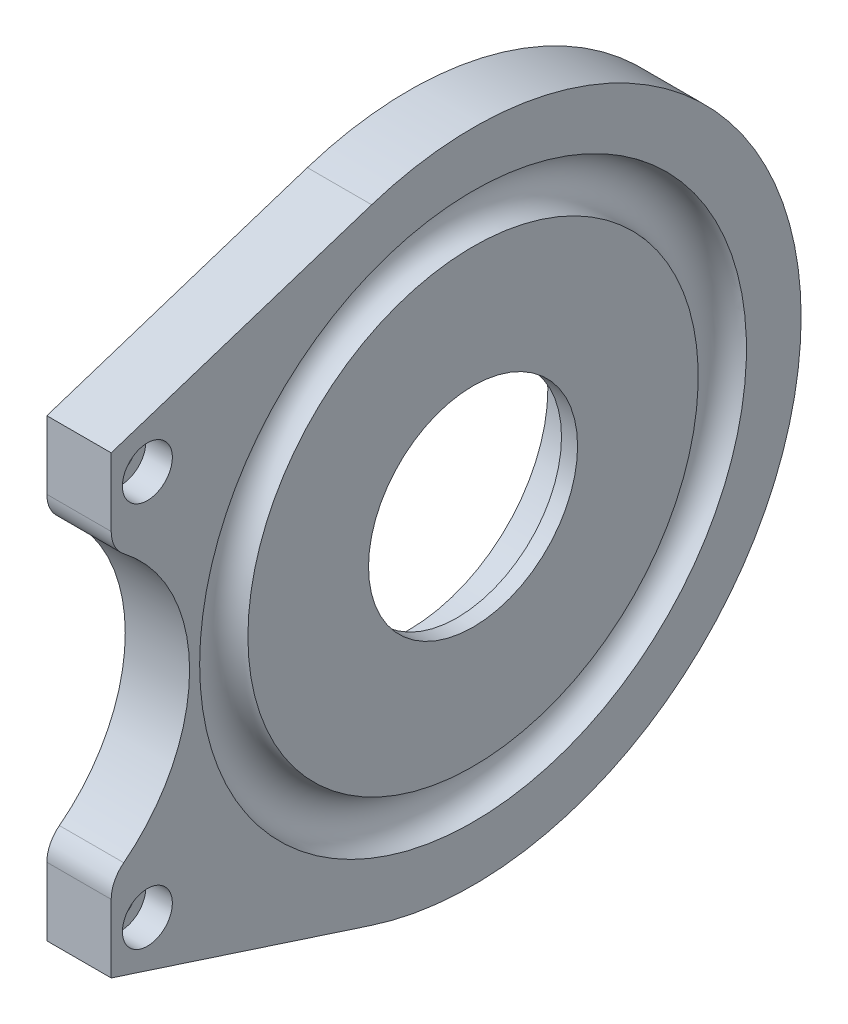
ISO-10303-21;
HEADER;
FILE_DESCRIPTION(('STEP AP214'),'2;1');
FILE_NAME('part.step','',(''),(''),'','','');
FILE_SCHEMA(('AUTOMOTIVE_DESIGN { 1 0 10303 214 1 1 1 1 }'));
ENDSEC;
DATA;
#1=APPLICATION_CONTEXT('core data for automotive mechanical design processes');
#2=APPLICATION_PROTOCOL_DEFINITION('international standard','automotive_design',2000,#1);
#3=PRODUCT_CONTEXT('',#1,'mechanical');
#4=PRODUCT('Part','Part','',(#3));
#5=PRODUCT_RELATED_PRODUCT_CATEGORY('part','',(#4));
#6=PRODUCT_DEFINITION_FORMATION('','',#4);
#7=PRODUCT_DEFINITION_CONTEXT('part definition',#1,'design');
#8=PRODUCT_DEFINITION('design','',#6,#7);
#9=PRODUCT_DEFINITION_SHAPE('','',#8);
#10=(LENGTH_UNIT() NAMED_UNIT(*) SI_UNIT(.MILLI.,.METRE.));
#11=(NAMED_UNIT(*) PLANE_ANGLE_UNIT() SI_UNIT($,.RADIAN.));
#12=(NAMED_UNIT(*) SI_UNIT($,.STERADIAN.) SOLID_ANGLE_UNIT());
#13=UNCERTAINTY_MEASURE_WITH_UNIT(LENGTH_MEASURE(1.E-05),#10,'distance_accuracy_value','');
#14=(GEOMETRIC_REPRESENTATION_CONTEXT(3) GLOBAL_UNCERTAINTY_ASSIGNED_CONTEXT((#13)) GLOBAL_UNIT_ASSIGNED_CONTEXT((#10,
#11,#12)) REPRESENTATION_CONTEXT('',''));
#15=CARTESIAN_POINT('',(0.,0.,0.));
#16=DIRECTION('',(0.,0.,1.));
#17=DIRECTION('',(1.,0.,0.));
#18=AXIS2_PLACEMENT_3D('',#15,#16,#17);
#19=CARTESIAN_POINT('',(8.,-19.8100353356576,41.));
#20=DIRECTION('',(1.,0.,0.));
#21=DIRECTION('',(0.,0.,-1.));
#22=AXIS2_PLACEMENT_3D('',#19,#20,#21);
#23=PLANE('',#22);
#24=CARTESIAN_POINT('',(8.,-23.9987747843717,40.5));
#25=DIRECTION('',(1.,0.,0.));
#26=DIRECTION('',(0.,0.,-1.));
#27=AXIS2_PLACEMENT_3D('',#24,#25,#26);
#28=CIRCLE('',#27,3.105);
#29=CARTESIAN_POINT('',(8.,-23.9987747843717,37.395));
#30=VERTEX_POINT('',#29);
#31=EDGE_CURVE('E195',#30,#30,#28,.T.);
#32=ORIENTED_EDGE('',*,*,#31,.F.);
#33=EDGE_LOOP('',(#32));
#34=FACE_BOUND('',#33,.T.);
#35=CARTESIAN_POINT('',(8.,23.9987747843718,40.5));
#36=DIRECTION('',(1.,0.,0.));
#37=DIRECTION('',(0.,0.,1.));
#38=AXIS2_PLACEMENT_3D('',#35,#36,#37);
#39=CIRCLE('',#38,3.105);
#40=CARTESIAN_POINT('',(8.,23.9987747843718,43.605));
#41=VERTEX_POINT('',#40);
#42=EDGE_CURVE('E188',#41,#41,#39,.T.);
#43=ORIENTED_EDGE('',*,*,#42,.F.);
#44=EDGE_LOOP('',(#43));
#45=FACE_BOUND('',#44,.T.);
#46=CARTESIAN_POINT('',(8.,-19.8100353356576,41.));
#47=DIRECTION('',(1.,0.,0.));
#48=DIRECTION('',(0.,0.,-1.));
#49=AXIS2_PLACEMENT_3D('',#46,#47,#48);
#50=CIRCLE('',#49,4.);
#51=CARTESIAN_POINT('',(8.,-16.6404296819524,43.44));
#52=VERTEX_POINT('',#51);
#53=CARTESIAN_POINT('',(8.,-19.8100353356575,45.));
#54=VERTEX_POINT('',#53);
#55=EDGE_CURVE('E149',#52,#54,#50,.T.);
#56=ORIENTED_EDGE('',*,*,#55,.T.);
#57=DIRECTION('',(0.,-1.,0.));
#58=VECTOR('',#57,1.);
#59=CARTESIAN_POINT('',(8.,-19.8100353356575,45.));
#60=LINE('',#59,#58);
#61=CARTESIAN_POINT('',(8.,-28.2782724184405,45.));
#62=VERTEX_POINT('',#61);
#63=EDGE_CURVE('E97',#54,#62,#60,.T.);
#64=ORIENTED_EDGE('',*,*,#63,.T.);
#65=DIRECTION('',(0.,-0.309016994374948,-0.951056516295153));
#66=VECTOR('',#65,1.);
#67=CARTESIAN_POINT('',(8.,-28.2782724184405,45.));
#68=LINE('',#67,#66);
#69=CARTESIAN_POINT('',(8.,-38.8031058648423,12.6078933704979));
#70=VERTEX_POINT('',#69);
#71=EDGE_CURVE('E164',#62,#70,#68,.T.);
#72=ORIENTED_EDGE('',*,*,#71,.T.);
#73=CARTESIAN_POINT('',(8.,0.,0.));
#74=DIRECTION('',(1.,0.,0.));
#75=DIRECTION('',(0.,0.,-1.));
#76=AXIS2_PLACEMENT_3D('',#73,#74,#75);
#77=CIRCLE('',#76,40.8);
#78=CARTESIAN_POINT('',(8.,38.8031058648423,12.6078933704978));
#79=VERTEX_POINT('',#78);
#80=EDGE_CURVE('E176',#70,#79,#77,.T.);
#81=ORIENTED_EDGE('',*,*,#80,.T.);
#82=DIRECTION('',(0.,-0.309016994374948,0.951056516295154));
#83=VECTOR('',#82,1.);
#84=CARTESIAN_POINT('',(8.,38.8031058648423,12.6078933704978));
#85=LINE('',#84,#83);
#86=CARTESIAN_POINT('',(8.,28.2782724184405,45.));
#87=VERTEX_POINT('',#86);
#88=EDGE_CURVE('E116',#79,#87,#85,.T.);
#89=ORIENTED_EDGE('',*,*,#88,.T.);
#90=DIRECTION('',(0.,-1.,0.));
#91=VECTOR('',#90,1.);
#92=CARTESIAN_POINT('',(8.,28.2782724184405,45.));
#93=LINE('',#92,#91);
#94=CARTESIAN_POINT('',(8.,19.8100353356576,45.));
#95=VERTEX_POINT('',#94);
#96=EDGE_CURVE('E110',#87,#95,#93,.T.);
#97=ORIENTED_EDGE('',*,*,#96,.T.);
#98=CARTESIAN_POINT('',(8.,19.8100353356576,41.));
#99=DIRECTION('',(1.,0.,0.));
#100=DIRECTION('',(0.,0.,-1.));
#101=AXIS2_PLACEMENT_3D('',#98,#99,#100);
#102=CIRCLE('',#101,4.);
#103=CARTESIAN_POINT('',(8.,16.6404296819524,43.44));
#104=VERTEX_POINT('',#103);
#105=EDGE_CURVE('E114',#95,#104,#102,.T.);
#106=ORIENTED_EDGE('',*,*,#105,.T.);
#107=CARTESIAN_POINT('',(8.,0.,56.25));
#108=DIRECTION('',(-1.,0.,0.));
#109=DIRECTION('',(0.,0.,-1.));
#110=AXIS2_PLACEMENT_3D('',#107,#108,#109);
#111=CIRCLE('',#110,21.);
#112=EDGE_CURVE('E54',#104,#52,#111,.T.);
#113=ORIENTED_EDGE('',*,*,#112,.T.);
#114=EDGE_LOOP('',(#56,#64,#72,#81,#89,#97,#106,#113));
#115=FACE_BOUND('',#114,.T.);
#116=CARTESIAN_POINT('',(8.,0.,0.));
#117=DIRECTION('',(-1.,0.,0.));
#118=DIRECTION('',(0.,0.,1.));
#119=AXIS2_PLACEMENT_3D('',#116,#117,#118);
#120=CIRCLE('',#119,34.);
#121=CARTESIAN_POINT('',(8.,0.,34.));
#122=VERTEX_POINT('',#121);
#123=EDGE_CURVE('E184',#122,#122,#120,.T.);
#124=ORIENTED_EDGE('',*,*,#123,.T.);
#125=EDGE_LOOP('',(#124));
#126=FACE_BOUND('',#125,.T.);
#127=ADVANCED_FACE('F37',(#34,#45,#115,#126),#23,.T.);
#128=CARTESIAN_POINT('',(8.,-19.8100353356576,41.));
#129=DIRECTION('',(-1.,0.,0.));
#130=DIRECTION('',(0.,0.,1.));
#131=AXIS2_PLACEMENT_3D('',#128,#129,#130);
#132=CYLINDRICAL_SURFACE('',#131,4.);
#133=CARTESIAN_POINT('',(0.,-19.8100353356576,41.));
#134=DIRECTION('',(1.,0.,0.));
#135=DIRECTION('',(0.,0.,-1.));
#136=AXIS2_PLACEMENT_3D('',#133,#134,#135);
#137=CIRCLE('',#136,4.);
#138=CARTESIAN_POINT('',(0.,-16.6404296819524,43.44));
#139=VERTEX_POINT('',#138);
#140=CARTESIAN_POINT('',(0.,-19.8100353356575,45.));
#141=VERTEX_POINT('',#140);
#142=EDGE_CURVE('E134',#139,#141,#137,.T.);
#143=ORIENTED_EDGE('',*,*,#142,.T.);
#144=DIRECTION('',(-1.,0.,0.));
#145=VECTOR('',#144,1.);
#146=CARTESIAN_POINT('',(8.,-19.8100353356575,45.));
#147=LINE('',#146,#145);
#148=EDGE_CURVE('E11',#54,#141,#147,.T.);
#149=ORIENTED_EDGE('',*,*,#148,.F.);
#150=ORIENTED_EDGE('',*,*,#55,.F.);
#151=DIRECTION('',(-1.,0.,0.));
#152=VECTOR('',#151,1.);
#153=CARTESIAN_POINT('',(8.,-16.6404296819524,43.44));
#154=LINE('',#153,#152);
#155=EDGE_CURVE('E130',#52,#139,#154,.T.);
#156=ORIENTED_EDGE('',*,*,#155,.T.);
#157=EDGE_LOOP('',(#143,#149,#150,#156));
#158=FACE_BOUND('',#157,.T.);
#159=ADVANCED_FACE('F39',(#158),#132,.T.);
#160=CARTESIAN_POINT('',(8.,-19.8100353356575,45.));
#161=DIRECTION('',(0.,0.,-1.));
#162=DIRECTION('',(-1.,0.,0.));
#163=AXIS2_PLACEMENT_3D('',#160,#161,#162);
#164=PLANE('',#163);
#165=DIRECTION('',(0.,-1.,0.));
#166=VECTOR('',#165,1.);
#167=CARTESIAN_POINT('',(0.,-19.8100353356575,45.));
#168=LINE('',#167,#166);
#169=CARTESIAN_POINT('',(0.,-28.2782724184405,45.));
#170=VERTEX_POINT('',#169);
#171=EDGE_CURVE('E137',#141,#170,#168,.T.);
#172=ORIENTED_EDGE('',*,*,#171,.T.);
#173=DIRECTION('',(-1.,0.,0.));
#174=VECTOR('',#173,1.);
#175=CARTESIAN_POINT('',(8.,-28.2782724184405,45.));
#176=LINE('',#175,#174);
#177=EDGE_CURVE('E46',#62,#170,#176,.T.);
#178=ORIENTED_EDGE('',*,*,#177,.F.);
#179=ORIENTED_EDGE('',*,*,#63,.F.);
#180=ORIENTED_EDGE('',*,*,#148,.T.);
#181=EDGE_LOOP('',(#172,#178,#179,#180));
#182=FACE_BOUND('',#181,.T.);
#183=ADVANCED_FACE('F281',(#182),#164,.F.);
#184=CARTESIAN_POINT('',(8.,-28.2782724184405,45.));
#185=DIRECTION('',(0.,0.951056516295154,-0.309016994374948));
#186=DIRECTION('',(0.,0.309016994374948,0.951056516295154));
#187=AXIS2_PLACEMENT_3D('',#184,#185,#186);
#188=PLANE('',#187);
#189=DIRECTION('',(0.,-0.309016994374948,-0.951056516295153));
#190=VECTOR('',#189,1.);
#191=CARTESIAN_POINT('',(0.,-28.2782724184405,45.));
#192=LINE('',#191,#190);
#193=CARTESIAN_POINT('',(0.,-38.8031058648423,12.6078933704979));
#194=VERTEX_POINT('',#193);
#195=EDGE_CURVE('E140',#170,#194,#192,.T.);
#196=ORIENTED_EDGE('',*,*,#195,.T.);
#197=DIRECTION('',(-1.,0.,0.));
#198=VECTOR('',#197,1.);
#199=CARTESIAN_POINT('',(8.,-38.8031058648423,12.6078933704979));
#200=LINE('',#199,#198);
#201=EDGE_CURVE('E156',#70,#194,#200,.T.);
#202=ORIENTED_EDGE('',*,*,#201,.F.);
#203=ORIENTED_EDGE('',*,*,#71,.F.);
#204=ORIENTED_EDGE('',*,*,#177,.T.);
#205=EDGE_LOOP('',(#196,#202,#203,#204));
#206=FACE_BOUND('',#205,.T.);
#207=ADVANCED_FACE('F162',(#206),#188,.F.);
#208=CARTESIAN_POINT('',(8.,0.,0.));
#209=DIRECTION('',(-1.,0.,0.));
#210=DIRECTION('',(0.,0.,1.));
#211=AXIS2_PLACEMENT_3D('',#208,#209,#210);
#212=CYLINDRICAL_SURFACE('',#211,40.8);
#213=CARTESIAN_POINT('',(0.,0.,0.));
#214=DIRECTION('',(1.,0.,0.));
#215=DIRECTION('',(0.,0.,-1.));
#216=AXIS2_PLACEMENT_3D('',#213,#214,#215);
#217=CIRCLE('',#216,40.8);
#218=CARTESIAN_POINT('',(0.,38.8031058648423,12.6078933704978));
#219=VERTEX_POINT('',#218);
#220=EDGE_CURVE('E142',#194,#219,#217,.T.);
#221=ORIENTED_EDGE('',*,*,#220,.T.);
#222=DIRECTION('',(-1.,0.,0.));
#223=VECTOR('',#222,1.);
#224=CARTESIAN_POINT('',(8.,38.8031058648423,12.6078933704978));
#225=LINE('',#224,#223);
#226=EDGE_CURVE('E153',#79,#219,#225,.T.);
#227=ORIENTED_EDGE('',*,*,#226,.F.);
#228=ORIENTED_EDGE('',*,*,#80,.F.);
#229=ORIENTED_EDGE('',*,*,#201,.T.);
#230=EDGE_LOOP('',(#221,#227,#228,#229));
#231=FACE_BOUND('',#230,.T.);
#232=ADVANCED_FACE('F172',(#231),#212,.T.);
#233=CARTESIAN_POINT('',(8.,38.8031058648423,12.6078933704978));
#234=DIRECTION('',(0.,-0.951056516295154,-0.309016994374948));
#235=DIRECTION('',(0.,0.309016994374948,-0.951056516295154));
#236=AXIS2_PLACEMENT_3D('',#233,#234,#235);
#237=PLANE('',#236);
#238=DIRECTION('',(0.,-0.309016994374948,0.951056516295154));
#239=VECTOR('',#238,1.);
#240=CARTESIAN_POINT('',(0.,38.8031058648423,12.6078933704978));
#241=LINE('',#240,#239);
#242=CARTESIAN_POINT('',(0.,28.2782724184405,45.));
#243=VERTEX_POINT('',#242);
#244=EDGE_CURVE('E144',#219,#243,#241,.T.);
#245=ORIENTED_EDGE('',*,*,#244,.T.);
#246=DIRECTION('',(-1.,0.,0.));
#247=VECTOR('',#246,1.);
#248=CARTESIAN_POINT('',(8.,28.2782724184405,45.));
#249=LINE('',#248,#247);
#250=EDGE_CURVE('E125',#87,#243,#249,.T.);
#251=ORIENTED_EDGE('',*,*,#250,.F.);
#252=ORIENTED_EDGE('',*,*,#88,.F.);
#253=ORIENTED_EDGE('',*,*,#226,.T.);
#254=EDGE_LOOP('',(#245,#251,#252,#253));
#255=FACE_BOUND('',#254,.T.);
#256=ADVANCED_FACE('F175',(#255),#237,.F.);
#257=CARTESIAN_POINT('',(8.,28.2782724184405,45.));
#258=DIRECTION('',(0.,0.,-1.));
#259=DIRECTION('',(0.,1.,0.));
#260=AXIS2_PLACEMENT_3D('',#257,#258,#259);
#261=PLANE('',#260);
#262=DIRECTION('',(0.,-1.,0.));
#263=VECTOR('',#262,1.);
#264=CARTESIAN_POINT('',(0.,28.2782724184405,45.));
#265=LINE('',#264,#263);
#266=CARTESIAN_POINT('',(0.,19.8100353356576,45.));
#267=VERTEX_POINT('',#266);
#268=EDGE_CURVE('E124',#243,#267,#265,.T.);
#269=ORIENTED_EDGE('',*,*,#268,.T.);
#270=DIRECTION('',(-1.,0.,0.));
#271=VECTOR('',#270,1.);
#272=CARTESIAN_POINT('',(8.,19.8100353356576,45.));
#273=LINE('',#272,#271);
#274=EDGE_CURVE('E121',#95,#267,#273,.T.);
#275=ORIENTED_EDGE('',*,*,#274,.F.);
#276=ORIENTED_EDGE('',*,*,#96,.F.);
#277=ORIENTED_EDGE('',*,*,#250,.T.);
#278=EDGE_LOOP('',(#269,#275,#276,#277));
#279=FACE_BOUND('',#278,.T.);
#280=ADVANCED_FACE('F122',(#279),#261,.F.);
#281=CARTESIAN_POINT('',(8.,19.8100353356576,41.));
#282=DIRECTION('',(-1.,0.,0.));
#283=DIRECTION('',(0.,0.,1.));
#284=AXIS2_PLACEMENT_3D('',#281,#282,#283);
#285=CYLINDRICAL_SURFACE('',#284,4.);
#286=CARTESIAN_POINT('',(0.,19.8100353356576,41.));
#287=DIRECTION('',(1.,0.,0.));
#288=DIRECTION('',(0.,0.,-1.));
#289=AXIS2_PLACEMENT_3D('',#286,#287,#288);
#290=CIRCLE('',#289,4.);
#291=CARTESIAN_POINT('',(0.,16.6404296819524,43.44));
#292=VERTEX_POINT('',#291);
#293=EDGE_CURVE('E83',#267,#292,#290,.T.);
#294=ORIENTED_EDGE('',*,*,#293,.T.);
#295=DIRECTION('',(-1.,0.,0.));
#296=VECTOR('',#295,1.);
#297=CARTESIAN_POINT('',(8.,16.6404296819524,43.44));
#298=LINE('',#297,#296);
#299=EDGE_CURVE('E126',#104,#292,#298,.T.);
#300=ORIENTED_EDGE('',*,*,#299,.F.);
#301=ORIENTED_EDGE('',*,*,#105,.F.);
#302=ORIENTED_EDGE('',*,*,#274,.T.);
#303=EDGE_LOOP('',(#294,#300,#301,#302));
#304=FACE_BOUND('',#303,.T.);
#305=ADVANCED_FACE('F128',(#304),#285,.T.);
#306=CARTESIAN_POINT('',(8.,0.,56.25));
#307=DIRECTION('',(-1.,0.,0.));
#308=DIRECTION('',(0.,0.,1.));
#309=AXIS2_PLACEMENT_3D('',#306,#307,#308);
#310=CYLINDRICAL_SURFACE('',#309,21.);
#311=CARTESIAN_POINT('',(0.,0.,56.25));
#312=DIRECTION('',(-1.,0.,0.));
#313=DIRECTION('',(0.,0.,-1.));
#314=AXIS2_PLACEMENT_3D('',#311,#312,#313);
#315=CIRCLE('',#314,21.);
#316=EDGE_CURVE('E89',#292,#139,#315,.T.);
#317=ORIENTED_EDGE('',*,*,#316,.T.);
#318=ORIENTED_EDGE('',*,*,#155,.F.);
#319=ORIENTED_EDGE('',*,*,#112,.F.);
#320=ORIENTED_EDGE('',*,*,#299,.T.);
#321=EDGE_LOOP('',(#317,#318,#319,#320));
#322=FACE_BOUND('',#321,.T.);
#323=ADVANCED_FACE('F249',(#322),#310,.F.);
#324=CARTESIAN_POINT('',(0.,-19.8100353356576,41.));
#325=DIRECTION('',(1.,0.,0.));
#326=DIRECTION('',(0.,0.,-1.));
#327=AXIS2_PLACEMENT_3D('',#324,#325,#326);
#328=PLANE('',#327);
#329=CARTESIAN_POINT('',(0.,0.,0.));
#330=DIRECTION('',(-1.,0.,0.));
#331=DIRECTION('',(0.,0.,1.));
#332=AXIS2_PLACEMENT_3D('',#329,#330,#331);
#333=CIRCLE('',#332,17.3);
#334=CARTESIAN_POINT('',(0.,0.,17.3));
#335=VERTEX_POINT('',#334);
#336=EDGE_CURVE('E212',#335,#335,#333,.T.);
#337=ORIENTED_EDGE('',*,*,#336,.F.);
#338=EDGE_LOOP('',(#337));
#339=FACE_BOUND('',#338,.T.);
#340=CARTESIAN_POINT('',(0.,-23.9987747843717,40.5));
#341=DIRECTION('',(1.,0.,0.));
#342=DIRECTION('',(0.,0.,-1.));
#343=AXIS2_PLACEMENT_3D('',#340,#341,#342);
#344=CIRCLE('',#343,1.65);
#345=CARTESIAN_POINT('',(0.,-23.9987747843717,38.85));
#346=VERTEX_POINT('',#345);
#347=EDGE_CURVE('E192',#346,#346,#344,.T.);
#348=ORIENTED_EDGE('',*,*,#347,.T.);
#349=EDGE_LOOP('',(#348));
#350=FACE_BOUND('',#349,.T.);
#351=CARTESIAN_POINT('',(0.,23.9987747843718,40.5));
#352=DIRECTION('',(1.,0.,0.));
#353=DIRECTION('',(0.,0.,1.));
#354=AXIS2_PLACEMENT_3D('',#351,#352,#353);
#355=CIRCLE('',#354,1.65);
#356=CARTESIAN_POINT('',(0.,23.9987747843718,42.15));
#357=VERTEX_POINT('',#356);
#358=EDGE_CURVE('E203',#357,#357,#355,.T.);
#359=ORIENTED_EDGE('',*,*,#358,.T.);
#360=EDGE_LOOP('',(#359));
#361=FACE_BOUND('',#360,.T.);
#362=ORIENTED_EDGE('',*,*,#142,.F.);
#363=ORIENTED_EDGE('',*,*,#316,.F.);
#364=ORIENTED_EDGE('',*,*,#293,.F.);
#365=ORIENTED_EDGE('',*,*,#268,.F.);
#366=ORIENTED_EDGE('',*,*,#244,.F.);
#367=ORIENTED_EDGE('',*,*,#220,.F.);
#368=ORIENTED_EDGE('',*,*,#195,.F.);
#369=ORIENTED_EDGE('',*,*,#171,.F.);
#370=EDGE_LOOP('',(#362,#363,#364,#365,#366,#367,#368,#369));
#371=FACE_BOUND('',#370,.T.);
#372=ADVANCED_FACE('F168',(#339,#350,#361,#371),#328,.F.);
#373=CARTESIAN_POINT('',(8.,0.,0.));
#374=DIRECTION('',(-1.,0.,0.));
#375=DIRECTION('',(0.,0.,1.));
#376=AXIS2_PLACEMENT_3D('',#373,#374,#375);
#377=TOROIDAL_SURFACE('',#376,31.,3.);
#378=CARTESIAN_POINT('',(8.,0.,0.));
#379=DIRECTION('',(-1.,0.,0.));
#380=DIRECTION('',(0.,0.,1.));
#381=AXIS2_PLACEMENT_3D('',#378,#379,#380);
#382=CIRCLE('',#381,28.);
#383=CARTESIAN_POINT('',(8.,0.,28.));
#384=VERTEX_POINT('',#383);
#385=EDGE_CURVE('E138',#384,#384,#382,.T.);
#386=ORIENTED_EDGE('',*,*,#385,.T.);
#387=EDGE_LOOP('',(#386));
#388=FACE_BOUND('',#387,.T.);
#389=ORIENTED_EDGE('',*,*,#123,.F.);
#390=EDGE_LOOP('',(#389));
#391=FACE_BOUND('',#390,.T.);
#392=ADVANCED_FACE('F248',(#388,#391),#377,.F.);
#393=CARTESIAN_POINT('',(8.,0.,0.));
#394=DIRECTION('',(-1.,0.,0.));
#395=DIRECTION('',(0.,0.,1.));
#396=AXIS2_PLACEMENT_3D('',#393,#394,#395);
#397=CIRCLE('',#396,13.);
#398=CARTESIAN_POINT('',(8.,0.,13.));
#399=VERTEX_POINT('',#398);
#400=EDGE_CURVE('E215',#399,#399,#397,.T.);
#401=ORIENTED_EDGE('',*,*,#400,.T.);
#402=EDGE_LOOP('',(#401));
#403=FACE_BOUND('',#402,.T.);
#404=ORIENTED_EDGE('',*,*,#385,.F.);
#405=EDGE_LOOP('',(#404));
#406=FACE_BOUND('',#405,.T.);
#407=ADVANCED_FACE('F224',(#403,#406),#23,.T.);
#408=CARTESIAN_POINT('',(4.7,23.9987747843718,40.5));
#409=DIRECTION('',(1.,0.,0.));
#410=DIRECTION('',(0.,0.,-1.));
#411=AXIS2_PLACEMENT_3D('',#408,#409,#410);
#412=CYLINDRICAL_SURFACE('',#411,3.105);
#413=CARTESIAN_POINT('',(4.7,23.9987747843718,40.5));
#414=DIRECTION('',(1.,0.,0.));
#415=DIRECTION('',(0.,0.,1.));
#416=AXIS2_PLACEMENT_3D('',#413,#414,#415);
#417=CIRCLE('',#416,3.105);
#418=CARTESIAN_POINT('',(4.7,23.9987747843718,43.605));
#419=VERTEX_POINT('',#418);
#420=EDGE_CURVE('E191',#419,#419,#417,.T.);
#421=ORIENTED_EDGE('',*,*,#420,.F.);
#422=EDGE_LOOP('',(#421));
#423=FACE_BOUND('',#422,.T.);
#424=ORIENTED_EDGE('',*,*,#42,.T.);
#425=EDGE_LOOP('',(#424));
#426=FACE_BOUND('',#425,.T.);
#427=ADVANCED_FACE('F266',(#423,#426),#412,.F.);
#428=CARTESIAN_POINT('',(4.7,23.9987747843718,40.5));
#429=DIRECTION('',(-1.,0.,0.));
#430=DIRECTION('',(0.,0.,1.));
#431=AXIS2_PLACEMENT_3D('',#428,#429,#430);
#432=PLANE('',#431);
#433=CARTESIAN_POINT('',(4.7,23.9987747843718,40.5));
#434=DIRECTION('',(1.,0.,0.));
#435=DIRECTION('',(0.,0.,1.));
#436=AXIS2_PLACEMENT_3D('',#433,#434,#435);
#437=CIRCLE('',#436,1.65);
#438=CARTESIAN_POINT('',(4.7,23.9987747843718,42.15));
#439=VERTEX_POINT('',#438);
#440=EDGE_CURVE('E200',#439,#439,#437,.T.);
#441=ORIENTED_EDGE('',*,*,#440,.F.);
#442=EDGE_LOOP('',(#441));
#443=FACE_BOUND('',#442,.T.);
#444=ORIENTED_EDGE('',*,*,#420,.T.);
#445=EDGE_LOOP('',(#444));
#446=FACE_BOUND('',#445,.T.);
#447=ADVANCED_FACE('F262',(#443,#446),#432,.F.);
#448=CARTESIAN_POINT('',(4.7,-23.9987747843717,40.5));
#449=DIRECTION('',(1.,0.,0.));
#450=DIRECTION('',(0.,0.,-1.));
#451=AXIS2_PLACEMENT_3D('',#448,#449,#450);
#452=CYLINDRICAL_SURFACE('',#451,3.105);
#453=CARTESIAN_POINT('',(4.7,-23.9987747843717,40.5));
#454=DIRECTION('',(1.,0.,0.));
#455=DIRECTION('',(0.,0.,-1.));
#456=AXIS2_PLACEMENT_3D('',#453,#454,#455);
#457=CIRCLE('',#456,3.105);
#458=CARTESIAN_POINT('',(4.7,-23.9987747843717,37.395));
#459=VERTEX_POINT('',#458);
#460=EDGE_CURVE('E187',#459,#459,#457,.T.);
#461=ORIENTED_EDGE('',*,*,#460,.F.);
#462=EDGE_LOOP('',(#461));
#463=FACE_BOUND('',#462,.T.);
#464=ORIENTED_EDGE('',*,*,#31,.T.);
#465=EDGE_LOOP('',(#464));
#466=FACE_BOUND('',#465,.T.);
#467=ADVANCED_FACE('F265',(#463,#466),#452,.F.);
#468=CARTESIAN_POINT('',(4.7,-23.9987747843717,40.5));
#469=DIRECTION('',(1.,0.,0.));
#470=DIRECTION('',(0.,0.,-1.));
#471=AXIS2_PLACEMENT_3D('',#468,#469,#470);
#472=PLANE('',#471);
#473=CARTESIAN_POINT('',(4.7,-23.9987747843717,40.5));
#474=DIRECTION('',(1.,0.,0.));
#475=DIRECTION('',(0.,0.,-1.));
#476=AXIS2_PLACEMENT_3D('',#473,#474,#475);
#477=CIRCLE('',#476,1.65);
#478=CARTESIAN_POINT('',(4.7,-23.9987747843717,38.85));
#479=VERTEX_POINT('',#478);
#480=EDGE_CURVE('E207',#479,#479,#477,.T.);
#481=ORIENTED_EDGE('',*,*,#480,.F.);
#482=EDGE_LOOP('',(#481));
#483=FACE_BOUND('',#482,.T.);
#484=ORIENTED_EDGE('',*,*,#460,.T.);
#485=EDGE_LOOP('',(#484));
#486=FACE_BOUND('',#485,.T.);
#487=ADVANCED_FACE('F258',(#483,#486),#472,.T.);
#488=CARTESIAN_POINT('',(0.,23.9987747843718,40.5));
#489=DIRECTION('',(1.,0.,0.));
#490=DIRECTION('',(0.,0.,-1.));
#491=AXIS2_PLACEMENT_3D('',#488,#489,#490);
#492=CYLINDRICAL_SURFACE('',#491,1.65);
#493=ORIENTED_EDGE('',*,*,#358,.F.);
#494=EDGE_LOOP('',(#493));
#495=FACE_BOUND('',#494,.T.);
#496=ORIENTED_EDGE('',*,*,#440,.T.);
#497=EDGE_LOOP('',(#496));
#498=FACE_BOUND('',#497,.T.);
#499=ADVANCED_FACE('F255',(#495,#498),#492,.F.);
#500=CARTESIAN_POINT('',(0.,-23.9987747843717,40.5));
#501=DIRECTION('',(1.,0.,0.));
#502=DIRECTION('',(0.,0.,-1.));
#503=AXIS2_PLACEMENT_3D('',#500,#501,#502);
#504=CYLINDRICAL_SURFACE('',#503,1.65);
#505=ORIENTED_EDGE('',*,*,#347,.F.);
#506=EDGE_LOOP('',(#505));
#507=FACE_BOUND('',#506,.T.);
#508=ORIENTED_EDGE('',*,*,#480,.T.);
#509=EDGE_LOOP('',(#508));
#510=FACE_BOUND('',#509,.T.);
#511=ADVANCED_FACE('F242',(#507,#510),#504,.F.);
#512=CARTESIAN_POINT('',(6.,0.,0.));
#513=DIRECTION('',(-1.,0.,0.));
#514=DIRECTION('',(0.,0.,1.));
#515=AXIS2_PLACEMENT_3D('',#512,#513,#514);
#516=CYLINDRICAL_SURFACE('',#515,17.3);
#517=CARTESIAN_POINT('',(6.,0.,0.));
#518=DIRECTION('',(-1.,0.,0.));
#519=DIRECTION('',(0.,0.,1.));
#520=AXIS2_PLACEMENT_3D('',#517,#518,#519);
#521=CIRCLE('',#520,17.3);
#522=CARTESIAN_POINT('',(6.,0.,17.3));
#523=VERTEX_POINT('',#522);
#524=EDGE_CURVE('E204',#523,#523,#521,.T.);
#525=ORIENTED_EDGE('',*,*,#524,.F.);
#526=EDGE_LOOP('',(#525));
#527=FACE_BOUND('',#526,.T.);
#528=ORIENTED_EDGE('',*,*,#336,.T.);
#529=EDGE_LOOP('',(#528));
#530=FACE_BOUND('',#529,.T.);
#531=ADVANCED_FACE('F236',(#527,#530),#516,.F.);
#532=CARTESIAN_POINT('',(6.,0.,0.));
#533=DIRECTION('',(-1.,0.,0.));
#534=DIRECTION('',(0.,0.,1.));
#535=AXIS2_PLACEMENT_3D('',#532,#533,#534);
#536=PLANE('',#535);
#537=CARTESIAN_POINT('',(6.,0.,0.));
#538=DIRECTION('',(-1.,0.,0.));
#539=DIRECTION('',(0.,0.,1.));
#540=AXIS2_PLACEMENT_3D('',#537,#538,#539);
#541=CIRCLE('',#540,13.);
#542=CARTESIAN_POINT('',(6.,0.,13.));
#543=VERTEX_POINT('',#542);
#544=EDGE_CURVE('E218',#543,#543,#541,.T.);
#545=ORIENTED_EDGE('',*,*,#544,.F.);
#546=EDGE_LOOP('',(#545));
#547=FACE_BOUND('',#546,.T.);
#548=ORIENTED_EDGE('',*,*,#524,.T.);
#549=EDGE_LOOP('',(#548));
#550=FACE_BOUND('',#549,.T.);
#551=ADVANCED_FACE('F230',(#547,#550),#536,.T.);
#552=CARTESIAN_POINT('',(8.,0.,0.));
#553=DIRECTION('',(-1.,0.,0.));
#554=DIRECTION('',(0.,0.,1.));
#555=AXIS2_PLACEMENT_3D('',#552,#553,#554);
#556=CYLINDRICAL_SURFACE('',#555,13.);
#557=ORIENTED_EDGE('',*,*,#400,.F.);
#558=EDGE_LOOP('',(#557));
#559=FACE_BOUND('',#558,.T.);
#560=ORIENTED_EDGE('',*,*,#544,.T.);
#561=EDGE_LOOP('',(#560));
#562=FACE_BOUND('',#561,.T.);
#563=ADVANCED_FACE('F227',(#559,#562),#556,.F.);
#564=CLOSED_SHELL('',(#127,#159,#183,#207,#232,#256,#280,#305,#323,#372,#392,#407,#427,#447,
#467,#487,#499,#511,#531,#551,#563));
#565=MANIFOLD_SOLID_BREP('B2',#564);
#566=ADVANCED_BREP_SHAPE_REPRESENTATION('',(#18,#565),#14);
#567=SHAPE_DEFINITION_REPRESENTATION(#9,#566);
ENDSEC;
END-ISO-10303-21;
